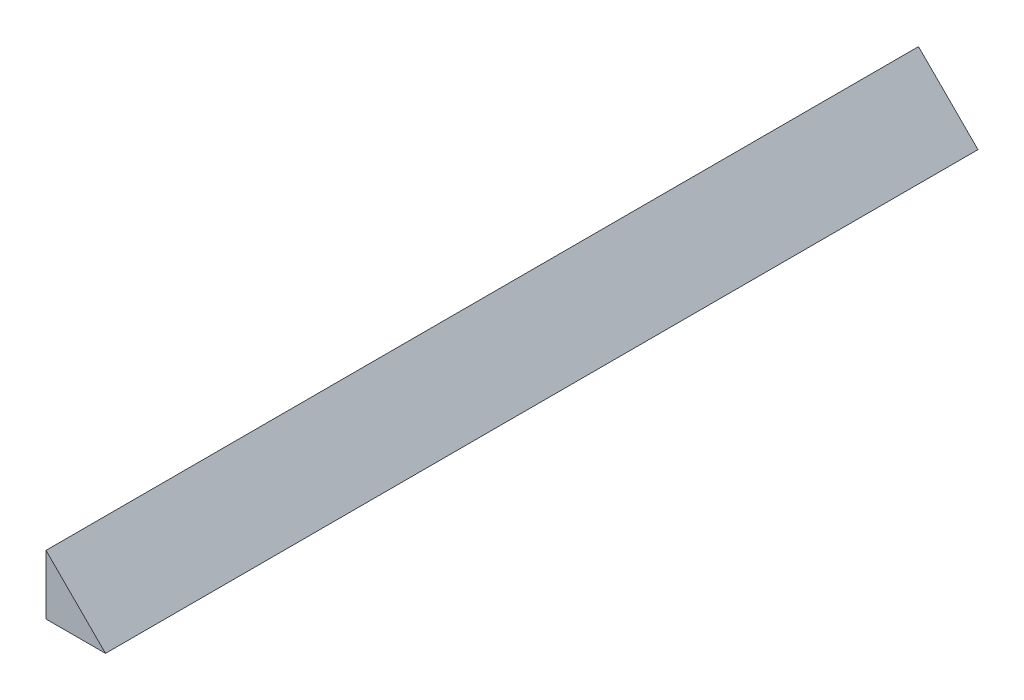
ISO-10303-21;
HEADER;
FILE_DESCRIPTION(('STEP AP214'),'2;1');
FILE_NAME('part.step','',(''),(''),'','','');
FILE_SCHEMA(('AUTOMOTIVE_DESIGN { 1 0 10303 214 1 1 1 1 }'));
ENDSEC;
DATA;
#1=APPLICATION_CONTEXT('core data for automotive mechanical design processes');
#2=APPLICATION_PROTOCOL_DEFINITION('international standard','automotive_design',2000,#1);
#3=PRODUCT_CONTEXT('',#1,'mechanical');
#4=PRODUCT('Part','Part','',(#3));
#5=PRODUCT_RELATED_PRODUCT_CATEGORY('part','',(#4));
#6=PRODUCT_DEFINITION_FORMATION('','',#4);
#7=PRODUCT_DEFINITION_CONTEXT('part definition',#1,'design');
#8=PRODUCT_DEFINITION('design','',#6,#7);
#9=PRODUCT_DEFINITION_SHAPE('','',#8);
#10=(LENGTH_UNIT() NAMED_UNIT(*) SI_UNIT(.MILLI.,.METRE.));
#11=(NAMED_UNIT(*) PLANE_ANGLE_UNIT() SI_UNIT($,.RADIAN.));
#12=(NAMED_UNIT(*) SI_UNIT($,.STERADIAN.) SOLID_ANGLE_UNIT());
#13=UNCERTAINTY_MEASURE_WITH_UNIT(LENGTH_MEASURE(1.E-05),#10,'distance_accuracy_value','');
#14=(GEOMETRIC_REPRESENTATION_CONTEXT(3) GLOBAL_UNCERTAINTY_ASSIGNED_CONTEXT((#13)) GLOBAL_UNIT_ASSIGNED_CONTEXT((#10,
#11,#12)) REPRESENTATION_CONTEXT('',''));
#15=CARTESIAN_POINT('',(0.,0.,0.));
#16=DIRECTION('',(0.,0.,1.));
#17=DIRECTION('',(1.,0.,0.));
#18=AXIS2_PLACEMENT_3D('',#15,#16,#17);
#19=CARTESIAN_POINT('',(15.,0.,220.));
#20=DIRECTION('',(0.,1.,0.));
#21=DIRECTION('',(-1.,0.,0.));
#22=AXIS2_PLACEMENT_3D('',#19,#20,#21);
#23=PLANE('',#22);
#24=DIRECTION('',(1.,0.,0.));
#25=VECTOR('',#24,1.);
#26=CARTESIAN_POINT('',(15.,0.,0.));
#27=LINE('',#26,#25);
#28=CARTESIAN_POINT('',(0.,0.,0.));
#29=VERTEX_POINT('',#28);
#30=CARTESIAN_POINT('',(15.,0.,0.));
#31=VERTEX_POINT('',#30);
#32=EDGE_CURVE('E95',#29,#31,#27,.T.);
#33=ORIENTED_EDGE('',*,*,#32,.T.);
#34=DIRECTION('',(0.,0.,-1.));
#35=VECTOR('',#34,1.);
#36=CARTESIAN_POINT('',(15.,0.,220.));
#37=LINE('',#36,#35);
#38=CARTESIAN_POINT('',(15.,0.,220.));
#39=VERTEX_POINT('',#38);
#40=EDGE_CURVE('E11',#39,#31,#37,.T.);
#41=ORIENTED_EDGE('',*,*,#40,.F.);
#42=DIRECTION('',(1.,0.,0.));
#43=VECTOR('',#42,1.);
#44=CARTESIAN_POINT('',(15.,0.,220.));
#45=LINE('',#44,#43);
#46=CARTESIAN_POINT('',(0.,0.,220.));
#47=VERTEX_POINT('',#46);
#48=EDGE_CURVE('E87',#47,#39,#45,.T.);
#49=ORIENTED_EDGE('',*,*,#48,.F.);
#50=DIRECTION('',(0.,0.,-1.));
#51=VECTOR('',#50,1.);
#52=CARTESIAN_POINT('',(0.,0.,220.));
#53=LINE('',#52,#51);
#54=EDGE_CURVE('E96',#47,#29,#53,.T.);
#55=ORIENTED_EDGE('',*,*,#54,.T.);
#56=EDGE_LOOP('',(#33,#41,#49,#55));
#57=FACE_BOUND('',#56,.T.);
#58=ADVANCED_FACE('F45',(#57),#23,.F.);
#59=CARTESIAN_POINT('',(0.,15.,220.));
#60=DIRECTION('',(-0.707106781186547,-0.707106781186547,0.));
#61=DIRECTION('',(0.707106781186548,-0.707106781186548,0.));
#62=AXIS2_PLACEMENT_3D('',#59,#60,#61);
#63=PLANE('',#62);
#64=DIRECTION('',(-0.707106781186547,0.707106781186547,0.));
#65=VECTOR('',#64,1.);
#66=CARTESIAN_POINT('',(0.,15.,0.));
#67=LINE('',#66,#65);
#68=CARTESIAN_POINT('',(0.,15.,0.));
#69=VERTEX_POINT('',#68);
#70=EDGE_CURVE('E74',#31,#69,#67,.T.);
#71=ORIENTED_EDGE('',*,*,#70,.T.);
#72=DIRECTION('',(0.,0.,-1.));
#73=VECTOR('',#72,1.);
#74=CARTESIAN_POINT('',(0.,15.,220.));
#75=LINE('',#74,#73);
#76=CARTESIAN_POINT('',(0.,15.,220.));
#77=VERTEX_POINT('',#76);
#78=EDGE_CURVE('E54',#77,#69,#75,.T.);
#79=ORIENTED_EDGE('',*,*,#78,.F.);
#80=DIRECTION('',(-0.707106781186547,0.707106781186547,0.));
#81=VECTOR('',#80,1.);
#82=CARTESIAN_POINT('',(0.,15.,220.));
#83=LINE('',#82,#81);
#84=EDGE_CURVE('E82',#39,#77,#83,.T.);
#85=ORIENTED_EDGE('',*,*,#84,.F.);
#86=ORIENTED_EDGE('',*,*,#40,.T.);
#87=EDGE_LOOP('',(#71,#79,#85,#86));
#88=FACE_BOUND('',#87,.T.);
#89=ADVANCED_FACE('F83',(#88),#63,.F.);
#90=CARTESIAN_POINT('',(0.,0.,220.));
#91=DIRECTION('',(1.,0.,0.));
#92=DIRECTION('',(0.,0.,-1.));
#93=AXIS2_PLACEMENT_3D('',#90,#91,#92);
#94=PLANE('',#93);
#95=DIRECTION('',(0.,-1.,0.));
#96=VECTOR('',#95,1.);
#97=CARTESIAN_POINT('',(0.,0.,0.));
#98=LINE('',#97,#96);
#99=EDGE_CURVE('E79',#69,#29,#98,.T.);
#100=ORIENTED_EDGE('',*,*,#99,.T.);
#101=ORIENTED_EDGE('',*,*,#54,.F.);
#102=DIRECTION('',(0.,-1.,0.));
#103=VECTOR('',#102,1.);
#104=CARTESIAN_POINT('',(0.,0.,220.));
#105=LINE('',#104,#103);
#106=EDGE_CURVE('E62',#77,#47,#105,.T.);
#107=ORIENTED_EDGE('',*,*,#106,.F.);
#108=ORIENTED_EDGE('',*,*,#78,.T.);
#109=EDGE_LOOP('',(#100,#101,#107,#108));
#110=FACE_BOUND('',#109,.T.);
#111=ADVANCED_FACE('F108',(#110),#94,.F.);
#112=CARTESIAN_POINT('',(0.,0.,220.));
#113=DIRECTION('',(0.,0.,-1.));
#114=DIRECTION('',(-1.,0.,0.));
#115=AXIS2_PLACEMENT_3D('',#112,#113,#114);
#116=PLANE('',#115);
#117=ORIENTED_EDGE('',*,*,#48,.T.);
#118=ORIENTED_EDGE('',*,*,#84,.T.);
#119=ORIENTED_EDGE('',*,*,#106,.T.);
#120=EDGE_LOOP('',(#117,#118,#119));
#121=FACE_BOUND('',#120,.T.);
#122=ADVANCED_FACE('F90',(#121),#116,.F.);
#123=CARTESIAN_POINT('',(0.,0.,0.));
#124=DIRECTION('',(0.,0.,-1.));
#125=DIRECTION('',(-1.,0.,0.));
#126=AXIS2_PLACEMENT_3D('',#123,#124,#125);
#127=PLANE('',#126);
#128=ORIENTED_EDGE('',*,*,#32,.F.);
#129=ORIENTED_EDGE('',*,*,#99,.F.);
#130=ORIENTED_EDGE('',*,*,#70,.F.);
#131=EDGE_LOOP('',(#128,#129,#130));
#132=FACE_BOUND('',#131,.T.);
#133=ADVANCED_FACE('F109',(#132),#127,.T.);
#134=CLOSED_SHELL('',(#58,#89,#111,#122,#133));
#135=MANIFOLD_SOLID_BREP('B2',#134);
#136=ADVANCED_BREP_SHAPE_REPRESENTATION('',(#18,#135),#14);
#137=SHAPE_DEFINITION_REPRESENTATION(#9,#136);
ENDSEC;
END-ISO-10303-21;
